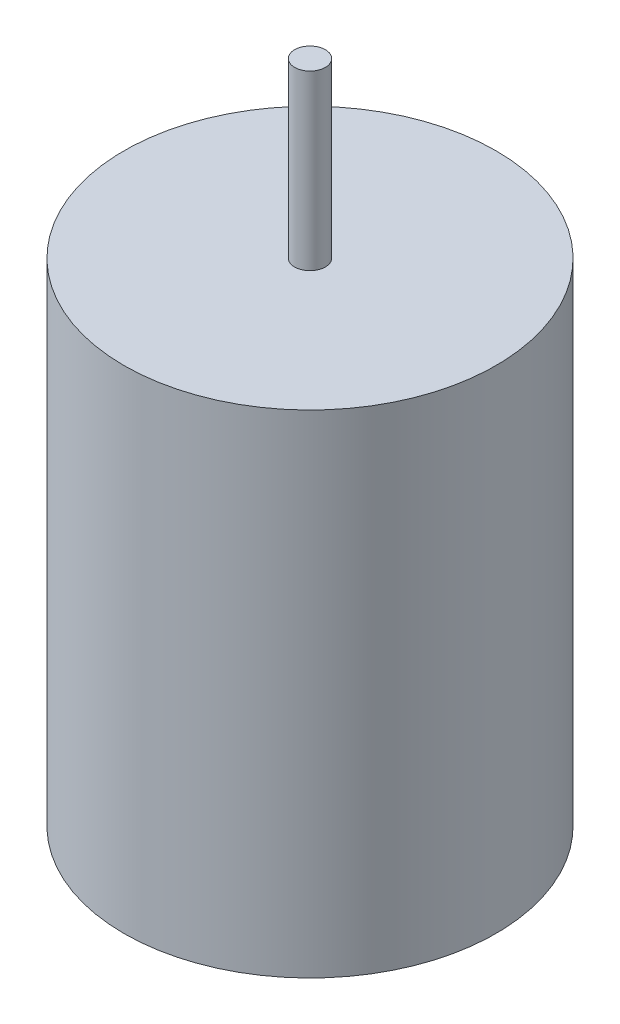
ISO-10303-21;
HEADER;
FILE_DESCRIPTION(('STEP AP214'),'2;1');
FILE_NAME('part.step','',(''),(''),'','','');
FILE_SCHEMA(('AUTOMOTIVE_DESIGN { 1 0 10303 214 1 1 1 1 }'));
ENDSEC;
DATA;
#1=APPLICATION_CONTEXT('core data for automotive mechanical design processes');
#2=APPLICATION_PROTOCOL_DEFINITION('international standard','automotive_design',2000,#1);
#3=PRODUCT_CONTEXT('',#1,'mechanical');
#4=PRODUCT('Part','Part','',(#3));
#5=PRODUCT_RELATED_PRODUCT_CATEGORY('part','',(#4));
#6=PRODUCT_DEFINITION_FORMATION('','',#4);
#7=PRODUCT_DEFINITION_CONTEXT('part definition',#1,'design');
#8=PRODUCT_DEFINITION('design','',#6,#7);
#9=PRODUCT_DEFINITION_SHAPE('','',#8);
#10=(LENGTH_UNIT() NAMED_UNIT(*) SI_UNIT(.MILLI.,.METRE.));
#11=(NAMED_UNIT(*) PLANE_ANGLE_UNIT() SI_UNIT($,.RADIAN.));
#12=(NAMED_UNIT(*) SI_UNIT($,.STERADIAN.) SOLID_ANGLE_UNIT());
#13=UNCERTAINTY_MEASURE_WITH_UNIT(LENGTH_MEASURE(1.E-05),#10,'distance_accuracy_value','');
#14=(GEOMETRIC_REPRESENTATION_CONTEXT(3) GLOBAL_UNCERTAINTY_ASSIGNED_CONTEXT((#13)) GLOBAL_UNIT_ASSIGNED_CONTEXT((#10,
#11,#12)) REPRESENTATION_CONTEXT('',''));
#15=CARTESIAN_POINT('',(0.,0.,0.));
#16=DIRECTION('',(0.,0.,1.));
#17=DIRECTION('',(1.,0.,0.));
#18=AXIS2_PLACEMENT_3D('',#15,#16,#17);
#19=CARTESIAN_POINT('',(0.,37.0078,0.));
#20=DIRECTION('',(0.,-1.,0.));
#21=DIRECTION('',(0.,0.,-1.));
#22=AXIS2_PLACEMENT_3D('',#19,#20,#21);
#23=CYLINDRICAL_SURFACE('',#22,13.9954);
#24=CARTESIAN_POINT('',(0.,37.0078,0.));
#25=DIRECTION('',(0.,1.,0.));
#26=DIRECTION('',(0.,0.,1.));
#27=AXIS2_PLACEMENT_3D('',#24,#25,#26);
#28=CIRCLE('',#27,13.9954);
#29=CARTESIAN_POINT('',(0.,37.0078,13.9954));
#30=VERTEX_POINT('',#29);
#31=EDGE_CURVE('E10',#30,#30,#28,.T.);
#32=ORIENTED_EDGE('',*,*,#31,.F.);
#33=EDGE_LOOP('',(#32));
#34=FACE_BOUND('',#33,.T.);
#35=CARTESIAN_POINT('',(0.,0.,0.));
#36=DIRECTION('',(0.,1.,0.));
#37=DIRECTION('',(0.,0.,1.));
#38=AXIS2_PLACEMENT_3D('',#35,#36,#37);
#39=CIRCLE('',#38,13.9954);
#40=CARTESIAN_POINT('',(0.,0.,13.9954));
#41=VERTEX_POINT('',#40);
#42=EDGE_CURVE('E37',#41,#41,#39,.T.);
#43=ORIENTED_EDGE('',*,*,#42,.T.);
#44=EDGE_LOOP('',(#43));
#45=FACE_BOUND('',#44,.T.);
#46=ADVANCED_FACE('F34',(#34,#45),#23,.T.);
#47=CARTESIAN_POINT('',(0.,37.0078,0.));
#48=DIRECTION('',(0.,1.,0.));
#49=DIRECTION('',(0.,0.,1.));
#50=AXIS2_PLACEMENT_3D('',#47,#48,#49);
#51=PLANE('',#50);
#52=CARTESIAN_POINT('',(0.,37.0078,0.));
#53=DIRECTION('',(0.,1.,0.));
#54=DIRECTION('',(0.,0.,1.));
#55=AXIS2_PLACEMENT_3D('',#52,#53,#54);
#56=CIRCLE('',#55,1.1557);
#57=CARTESIAN_POINT('',(0.,37.0078,1.1557));
#58=VERTEX_POINT('',#57);
#59=EDGE_CURVE('E46',#58,#58,#56,.T.);
#60=ORIENTED_EDGE('',*,*,#59,.F.);
#61=EDGE_LOOP('',(#60));
#62=FACE_BOUND('',#61,.T.);
#63=ORIENTED_EDGE('',*,*,#31,.T.);
#64=EDGE_LOOP('',(#63));
#65=FACE_BOUND('',#64,.T.);
#66=ADVANCED_FACE('F61',(#62,#65),#51,.T.);
#67=CARTESIAN_POINT('',(0.,0.,0.));
#68=DIRECTION('',(0.,1.,0.));
#69=DIRECTION('',(0.,0.,1.));
#70=AXIS2_PLACEMENT_3D('',#67,#68,#69);
#71=PLANE('',#70);
#72=ORIENTED_EDGE('',*,*,#42,.F.);
#73=EDGE_LOOP('',(#72));
#74=FACE_BOUND('',#73,.T.);
#75=ADVANCED_FACE('F57',(#74),#71,.F.);
#76=CARTESIAN_POINT('',(0.,50.0126,0.));
#77=DIRECTION('',(0.,-1.,0.));
#78=DIRECTION('',(0.,0.,-1.));
#79=AXIS2_PLACEMENT_3D('',#76,#77,#78);
#80=CYLINDRICAL_SURFACE('',#79,1.1557);
#81=CARTESIAN_POINT('',(0.,50.0126,0.));
#82=DIRECTION('',(0.,1.,0.));
#83=DIRECTION('',(0.,0.,1.));
#84=AXIS2_PLACEMENT_3D('',#81,#82,#83);
#85=CIRCLE('',#84,1.1557);
#86=CARTESIAN_POINT('',(0.,50.0126,1.1557));
#87=VERTEX_POINT('',#86);
#88=EDGE_CURVE('E44',#87,#87,#85,.T.);
#89=ORIENTED_EDGE('',*,*,#88,.F.);
#90=EDGE_LOOP('',(#89));
#91=FACE_BOUND('',#90,.T.);
#92=ORIENTED_EDGE('',*,*,#59,.T.);
#93=EDGE_LOOP('',(#92));
#94=FACE_BOUND('',#93,.T.);
#95=ADVANCED_FACE('F54',(#91,#94),#80,.T.);
#96=CARTESIAN_POINT('',(0.,50.0126,0.));
#97=DIRECTION('',(0.,1.,0.));
#98=DIRECTION('',(0.,0.,1.));
#99=AXIS2_PLACEMENT_3D('',#96,#97,#98);
#100=PLANE('',#99);
#101=ORIENTED_EDGE('',*,*,#88,.T.);
#102=EDGE_LOOP('',(#101));
#103=FACE_BOUND('',#102,.T.);
#104=ADVANCED_FACE('F52',(#103),#100,.T.);
#105=CLOSED_SHELL('',(#46,#66,#75,#95,#104));
#106=MANIFOLD_SOLID_BREP('B2',#105);
#107=ADVANCED_BREP_SHAPE_REPRESENTATION('',(#18,#106),#14);
#108=SHAPE_DEFINITION_REPRESENTATION(#9,#107);
ENDSEC;
END-ISO-10303-21;
